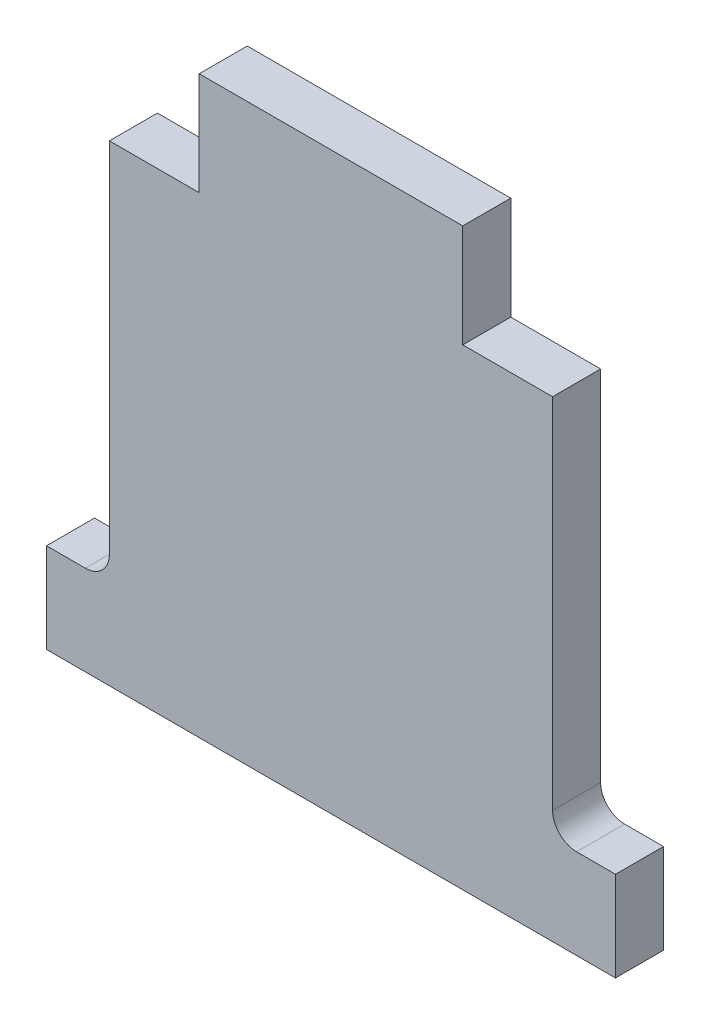
ISO-10303-21;
HEADER;
FILE_DESCRIPTION(('STEP AP214'),'2;1');
FILE_NAME('part.step','',(''),(''),'','','');
FILE_SCHEMA(('AUTOMOTIVE_DESIGN { 1 0 10303 214 1 1 1 1 }'));
ENDSEC;
DATA;
#1=APPLICATION_CONTEXT('core data for automotive mechanical design processes');
#2=APPLICATION_PROTOCOL_DEFINITION('international standard','automotive_design',2000,#1);
#3=PRODUCT_CONTEXT('',#1,'mechanical');
#4=PRODUCT('Part','Part','',(#3));
#5=PRODUCT_RELATED_PRODUCT_CATEGORY('part','',(#4));
#6=PRODUCT_DEFINITION_FORMATION('','',#4);
#7=PRODUCT_DEFINITION_CONTEXT('part definition',#1,'design');
#8=PRODUCT_DEFINITION('design','',#6,#7);
#9=PRODUCT_DEFINITION_SHAPE('','',#8);
#10=(LENGTH_UNIT() NAMED_UNIT(*) SI_UNIT(.MILLI.,.METRE.));
#11=(NAMED_UNIT(*) PLANE_ANGLE_UNIT() SI_UNIT($,.RADIAN.));
#12=(NAMED_UNIT(*) SI_UNIT($,.STERADIAN.) SOLID_ANGLE_UNIT());
#13=UNCERTAINTY_MEASURE_WITH_UNIT(LENGTH_MEASURE(1.E-05),#10,'distance_accuracy_value','');
#14=(GEOMETRIC_REPRESENTATION_CONTEXT(3) GLOBAL_UNCERTAINTY_ASSIGNED_CONTEXT((#13)) GLOBAL_UNIT_ASSIGNED_CONTEXT((#10,
#11,#12)) REPRESENTATION_CONTEXT('',''));
#15=CARTESIAN_POINT('',(0.,0.,0.));
#16=DIRECTION('',(0.,0.,1.));
#17=DIRECTION('',(1.,0.,0.));
#18=AXIS2_PLACEMENT_3D('',#15,#16,#17);
#19=CARTESIAN_POINT('',(-2.05,0.95,0.4));
#20=DIRECTION('',(0.,0.,-1.));
#21=DIRECTION('',(0.,-1.,0.));
#22=AXIS2_PLACEMENT_3D('',#19,#20,#21);
#23=PLANE('',#22);
#24=DIRECTION('',(0.,-1.,0.));
#25=VECTOR('',#24,1.);
#26=CARTESIAN_POINT('',(-2.375,0.,0.4));
#27=LINE('',#26,#25);
#28=CARTESIAN_POINT('',(-2.375,0.75,0.4));
#29=VERTEX_POINT('',#28);
#30=CARTESIAN_POINT('',(-2.375,0.,0.4));
#31=VERTEX_POINT('',#30);
#32=EDGE_CURVE('E228',#29,#31,#27,.T.);
#33=ORIENTED_EDGE('',*,*,#32,.T.);
#34=DIRECTION('',(1.,0.,0.));
#35=VECTOR('',#34,1.);
#36=CARTESIAN_POINT('',(-2.375,0.,0.4));
#37=LINE('',#36,#35);
#38=CARTESIAN_POINT('',(2.375,0.,0.4));
#39=VERTEX_POINT('',#38);
#40=EDGE_CURVE('E28',#31,#39,#37,.T.);
#41=ORIENTED_EDGE('',*,*,#40,.T.);
#42=DIRECTION('',(0.,1.,0.));
#43=VECTOR('',#42,1.);
#44=CARTESIAN_POINT('',(2.375,0.75,0.4));
#45=LINE('',#44,#43);
#46=CARTESIAN_POINT('',(2.375,0.75,0.4));
#47=VERTEX_POINT('',#46);
#48=EDGE_CURVE('E203',#39,#47,#45,.T.);
#49=ORIENTED_EDGE('',*,*,#48,.T.);
#50=DIRECTION('',(-1.,0.,0.));
#51=VECTOR('',#50,1.);
#52=CARTESIAN_POINT('',(2.05,0.75,0.4));
#53=LINE('',#52,#51);
#54=CARTESIAN_POINT('',(2.05,0.75,0.4));
#55=VERTEX_POINT('',#54);
#56=EDGE_CURVE('E233',#47,#55,#53,.T.);
#57=ORIENTED_EDGE('',*,*,#56,.T.);
#58=CARTESIAN_POINT('',(2.05,0.95,0.4));
#59=DIRECTION('',(0.,0.,-1.));
#60=DIRECTION('',(1.,0.,0.));
#61=AXIS2_PLACEMENT_3D('',#58,#59,#60);
#62=CIRCLE('',#61,0.2);
#63=CARTESIAN_POINT('',(1.85,0.95,0.4));
#64=VERTEX_POINT('',#63);
#65=EDGE_CURVE('E204',#55,#64,#62,.T.);
#66=ORIENTED_EDGE('',*,*,#65,.T.);
#67=DIRECTION('',(0.,1.,0.));
#68=VECTOR('',#67,1.);
#69=CARTESIAN_POINT('',(1.85,3.94,0.4));
#70=LINE('',#69,#68);
#71=CARTESIAN_POINT('',(1.85,3.94,0.4));
#72=VERTEX_POINT('',#71);
#73=EDGE_CURVE('E244',#64,#72,#70,.T.);
#74=ORIENTED_EDGE('',*,*,#73,.T.);
#75=DIRECTION('',(-1.,0.,0.));
#76=VECTOR('',#75,1.);
#77=CARTESIAN_POINT('',(1.1,3.94,0.4));
#78=LINE('',#77,#76);
#79=CARTESIAN_POINT('',(1.1,3.94,0.4));
#80=VERTEX_POINT('',#79);
#81=EDGE_CURVE('E219',#72,#80,#78,.T.);
#82=ORIENTED_EDGE('',*,*,#81,.T.);
#83=DIRECTION('',(0.,1.,0.));
#84=VECTOR('',#83,1.);
#85=CARTESIAN_POINT('',(1.1,4.8,0.4));
#86=LINE('',#85,#84);
#87=CARTESIAN_POINT('',(1.1,4.8,0.4));
#88=VERTEX_POINT('',#87);
#89=EDGE_CURVE('E198',#80,#88,#86,.T.);
#90=ORIENTED_EDGE('',*,*,#89,.T.);
#91=DIRECTION('',(-1.,0.,0.));
#92=VECTOR('',#91,1.);
#93=CARTESIAN_POINT('',(-1.1,4.8,0.4));
#94=LINE('',#93,#92);
#95=CARTESIAN_POINT('',(-1.1,4.8,0.4));
#96=VERTEX_POINT('',#95);
#97=EDGE_CURVE('E100',#88,#96,#94,.T.);
#98=ORIENTED_EDGE('',*,*,#97,.T.);
#99=DIRECTION('',(0.,-1.,0.));
#100=VECTOR('',#99,1.);
#101=CARTESIAN_POINT('',(-1.1,3.94,0.4));
#102=LINE('',#101,#100);
#103=CARTESIAN_POINT('',(-1.1,3.94,0.4));
#104=VERTEX_POINT('',#103);
#105=EDGE_CURVE('E187',#96,#104,#102,.T.);
#106=ORIENTED_EDGE('',*,*,#105,.T.);
#107=DIRECTION('',(-1.,0.,0.));
#108=VECTOR('',#107,1.);
#109=CARTESIAN_POINT('',(-1.85,3.94,0.4));
#110=LINE('',#109,#108);
#111=CARTESIAN_POINT('',(-1.85,3.94,0.4));
#112=VERTEX_POINT('',#111);
#113=EDGE_CURVE('E145',#104,#112,#110,.T.);
#114=ORIENTED_EDGE('',*,*,#113,.T.);
#115=DIRECTION('',(0.,-1.,0.));
#116=VECTOR('',#115,1.);
#117=CARTESIAN_POINT('',(-1.85,0.95,0.4));
#118=LINE('',#117,#116);
#119=CARTESIAN_POINT('',(-1.85,0.95,0.4));
#120=VERTEX_POINT('',#119);
#121=EDGE_CURVE('E176',#112,#120,#118,.T.);
#122=ORIENTED_EDGE('',*,*,#121,.T.);
#123=CARTESIAN_POINT('',(-2.05,0.95,0.4));
#124=DIRECTION('',(0.,0.,-1.));
#125=DIRECTION('',(-1.,0.,0.));
#126=AXIS2_PLACEMENT_3D('',#123,#124,#125);
#127=CIRCLE('',#126,0.2);
#128=CARTESIAN_POINT('',(-2.05,0.75,0.4));
#129=VERTEX_POINT('',#128);
#130=EDGE_CURVE('E21',#120,#129,#127,.T.);
#131=ORIENTED_EDGE('',*,*,#130,.T.);
#132=DIRECTION('',(-1.,0.,0.));
#133=VECTOR('',#132,1.);
#134=CARTESIAN_POINT('',(-2.375,0.75,0.4));
#135=LINE('',#134,#133);
#136=EDGE_CURVE('E209',#129,#29,#135,.T.);
#137=ORIENTED_EDGE('',*,*,#136,.T.);
#138=EDGE_LOOP('',(#33,#41,#49,#57,#66,#74,#82,#90,#98,#106,#114,#122,#131,#137));
#139=FACE_BOUND('',#138,.T.);
#140=ADVANCED_FACE('F17',(#139),#23,.F.);
#141=CARTESIAN_POINT('',(-2.05,0.95,-0.001));
#142=DIRECTION('',(0.,0.,-1.));
#143=DIRECTION('',(0.,-1.,0.));
#144=AXIS2_PLACEMENT_3D('',#141,#142,#143);
#145=PLANE('',#144);
#146=DIRECTION('',(0.,-1.,0.));
#147=VECTOR('',#146,1.);
#148=CARTESIAN_POINT('',(-2.375,0.,-0.001));
#149=LINE('',#148,#147);
#150=CARTESIAN_POINT('',(-2.375,0.75,-0.001));
#151=VERTEX_POINT('',#150);
#152=CARTESIAN_POINT('',(-2.375,0.,-0.001));
#153=VERTEX_POINT('',#152);
#154=EDGE_CURVE('E213',#151,#153,#149,.T.);
#155=ORIENTED_EDGE('',*,*,#154,.F.);
#156=DIRECTION('',(-1.,0.,0.));
#157=VECTOR('',#156,1.);
#158=CARTESIAN_POINT('',(-2.375,0.75,-0.001));
#159=LINE('',#158,#157);
#160=CARTESIAN_POINT('',(-2.05,0.75,-0.001));
#161=VERTEX_POINT('',#160);
#162=EDGE_CURVE('E171',#161,#151,#159,.T.);
#163=ORIENTED_EDGE('',*,*,#162,.F.);
#164=CARTESIAN_POINT('',(-2.05,0.95,-0.001));
#165=DIRECTION('',(0.,0.,-1.));
#166=DIRECTION('',(-1.,0.,0.));
#167=AXIS2_PLACEMENT_3D('',#164,#165,#166);
#168=CIRCLE('',#167,0.2);
#169=CARTESIAN_POINT('',(-1.85,0.95,-0.001));
#170=VERTEX_POINT('',#169);
#171=EDGE_CURVE('E167',#170,#161,#168,.T.);
#172=ORIENTED_EDGE('',*,*,#171,.F.);
#173=DIRECTION('',(0.,-1.,0.));
#174=VECTOR('',#173,1.);
#175=CARTESIAN_POINT('',(-1.85,0.95,-0.001));
#176=LINE('',#175,#174);
#177=CARTESIAN_POINT('',(-1.85,3.94,-0.001));
#178=VERTEX_POINT('',#177);
#179=EDGE_CURVE('E154',#178,#170,#176,.T.);
#180=ORIENTED_EDGE('',*,*,#179,.F.);
#181=DIRECTION('',(-1.,0.,0.));
#182=VECTOR('',#181,1.);
#183=CARTESIAN_POINT('',(-1.85,3.94,-0.001));
#184=LINE('',#183,#182);
#185=CARTESIAN_POINT('',(-1.1,3.94,-0.001));
#186=VERTEX_POINT('',#185);
#187=EDGE_CURVE('E189',#186,#178,#184,.T.);
#188=ORIENTED_EDGE('',*,*,#187,.F.);
#189=DIRECTION('',(0.,-1.,0.));
#190=VECTOR('',#189,1.);
#191=CARTESIAN_POINT('',(-1.1,3.94,-0.001));
#192=LINE('',#191,#190);
#193=CARTESIAN_POINT('',(-1.1,4.8,-0.001));
#194=VERTEX_POINT('',#193);
#195=EDGE_CURVE('E186',#194,#186,#192,.T.);
#196=ORIENTED_EDGE('',*,*,#195,.F.);
#197=DIRECTION('',(-1.,0.,0.));
#198=VECTOR('',#197,1.);
#199=CARTESIAN_POINT('',(-1.1,4.8,-0.001));
#200=LINE('',#199,#198);
#201=CARTESIAN_POINT('',(1.1,4.8,-0.001));
#202=VERTEX_POINT('',#201);
#203=EDGE_CURVE('E85',#202,#194,#200,.T.);
#204=ORIENTED_EDGE('',*,*,#203,.F.);
#205=DIRECTION('',(0.,1.,0.));
#206=VECTOR('',#205,1.);
#207=CARTESIAN_POINT('',(1.1,4.8,-0.001));
#208=LINE('',#207,#206);
#209=CARTESIAN_POINT('',(1.1,3.94,-0.001));
#210=VERTEX_POINT('',#209);
#211=EDGE_CURVE('E197',#210,#202,#208,.T.);
#212=ORIENTED_EDGE('',*,*,#211,.F.);
#213=DIRECTION('',(-1.,0.,0.));
#214=VECTOR('',#213,1.);
#215=CARTESIAN_POINT('',(1.1,3.94,-0.001));
#216=LINE('',#215,#214);
#217=CARTESIAN_POINT('',(1.85,3.94,-0.001));
#218=VERTEX_POINT('',#217);
#219=EDGE_CURVE('E256',#218,#210,#216,.T.);
#220=ORIENTED_EDGE('',*,*,#219,.F.);
#221=DIRECTION('',(0.,1.,0.));
#222=VECTOR('',#221,1.);
#223=CARTESIAN_POINT('',(1.85,3.94,-0.001));
#224=LINE('',#223,#222);
#225=CARTESIAN_POINT('',(1.85,0.95,-0.001));
#226=VERTEX_POINT('',#225);
#227=EDGE_CURVE('E208',#226,#218,#224,.T.);
#228=ORIENTED_EDGE('',*,*,#227,.F.);
#229=CARTESIAN_POINT('',(2.05,0.95,-0.001));
#230=DIRECTION('',(0.,0.,-1.));
#231=DIRECTION('',(1.,0.,0.));
#232=AXIS2_PLACEMENT_3D('',#229,#230,#231);
#233=CIRCLE('',#232,0.2);
#234=CARTESIAN_POINT('',(2.05,0.75,-0.001));
#235=VERTEX_POINT('',#234);
#236=EDGE_CURVE('E240',#235,#226,#233,.T.);
#237=ORIENTED_EDGE('',*,*,#236,.F.);
#238=DIRECTION('',(-1.,0.,0.));
#239=VECTOR('',#238,1.);
#240=CARTESIAN_POINT('',(2.05,0.75,-0.001));
#241=LINE('',#240,#239);
#242=CARTESIAN_POINT('',(2.375,0.75,-0.001));
#243=VERTEX_POINT('',#242);
#244=EDGE_CURVE('E216',#243,#235,#241,.T.);
#245=ORIENTED_EDGE('',*,*,#244,.F.);
#246=DIRECTION('',(0.,1.,0.));
#247=VECTOR('',#246,1.);
#248=CARTESIAN_POINT('',(2.375,0.75,-0.001));
#249=LINE('',#248,#247);
#250=CARTESIAN_POINT('',(2.375,0.,-0.001));
#251=VERTEX_POINT('',#250);
#252=EDGE_CURVE('E202',#251,#243,#249,.T.);
#253=ORIENTED_EDGE('',*,*,#252,.F.);
#254=DIRECTION('',(1.,0.,0.));
#255=VECTOR('',#254,1.);
#256=CARTESIAN_POINT('',(-2.375,0.,-0.001));
#257=LINE('',#256,#255);
#258=EDGE_CURVE('E11',#153,#251,#257,.T.);
#259=ORIENTED_EDGE('',*,*,#258,.F.);
#260=EDGE_LOOP('',(#155,#163,#172,#180,#188,#196,#204,#212,#220,#228,#237,#245,#253,#259));
#261=FACE_BOUND('',#260,.T.);
#262=ADVANCED_FACE('F169',(#261),#145,.T.);
#263=CARTESIAN_POINT('',(-2.375,0.,-0.001));
#264=DIRECTION('',(0.,-1.,0.));
#265=DIRECTION('',(0.,0.,-1.));
#266=AXIS2_PLACEMENT_3D('',#263,#264,#265);
#267=PLANE('',#266);
#268=DIRECTION('',(0.,0.,1.));
#269=VECTOR('',#268,1.);
#270=CARTESIAN_POINT('',(2.375,0.,-0.001));
#271=LINE('',#270,#269);
#272=EDGE_CURVE('E199',#251,#39,#271,.T.);
#273=ORIENTED_EDGE('',*,*,#272,.T.);
#274=ORIENTED_EDGE('',*,*,#40,.F.);
#275=DIRECTION('',(0.,0.,1.));
#276=VECTOR('',#275,1.);
#277=CARTESIAN_POINT('',(-2.375,0.,-0.001));
#278=LINE('',#277,#276);
#279=EDGE_CURVE('E251',#153,#31,#278,.T.);
#280=ORIENTED_EDGE('',*,*,#279,.F.);
#281=ORIENTED_EDGE('',*,*,#258,.T.);
#282=EDGE_LOOP('',(#273,#274,#280,#281));
#283=FACE_BOUND('',#282,.T.);
#284=ADVANCED_FACE('F19',(#283),#267,.T.);
#285=CARTESIAN_POINT('',(2.375,0.75,-0.001));
#286=DIRECTION('',(1.,0.,0.));
#287=DIRECTION('',(0.,1.,0.));
#288=AXIS2_PLACEMENT_3D('',#285,#286,#287);
#289=PLANE('',#288);
#290=DIRECTION('',(0.,0.,1.));
#291=VECTOR('',#290,1.);
#292=CARTESIAN_POINT('',(2.375,0.75,-0.001));
#293=LINE('',#292,#291);
#294=EDGE_CURVE('E229',#243,#47,#293,.T.);
#295=ORIENTED_EDGE('',*,*,#294,.T.);
#296=ORIENTED_EDGE('',*,*,#48,.F.);
#297=ORIENTED_EDGE('',*,*,#272,.F.);
#298=ORIENTED_EDGE('',*,*,#252,.T.);
#299=EDGE_LOOP('',(#295,#296,#297,#298));
#300=FACE_BOUND('',#299,.T.);
#301=ADVANCED_FACE('F318',(#300),#289,.T.);
#302=CARTESIAN_POINT('',(2.05,0.75,-0.001));
#303=DIRECTION('',(0.,1.,0.));
#304=DIRECTION('',(1.,0.,0.));
#305=AXIS2_PLACEMENT_3D('',#302,#303,#304);
#306=PLANE('',#305);
#307=DIRECTION('',(0.,0.,1.));
#308=VECTOR('',#307,1.);
#309=CARTESIAN_POINT('',(2.05,0.75,-0.001));
#310=LINE('',#309,#308);
#311=EDGE_CURVE('E207',#235,#55,#310,.T.);
#312=ORIENTED_EDGE('',*,*,#311,.T.);
#313=ORIENTED_EDGE('',*,*,#56,.F.);
#314=ORIENTED_EDGE('',*,*,#294,.F.);
#315=ORIENTED_EDGE('',*,*,#244,.T.);
#316=EDGE_LOOP('',(#312,#313,#314,#315));
#317=FACE_BOUND('',#316,.T.);
#318=ADVANCED_FACE('F326',(#317),#306,.T.);
#319=CARTESIAN_POINT('',(2.05,0.95,-0.001));
#320=DIRECTION('',(0.,0.,1.));
#321=DIRECTION('',(1.,0.,0.));
#322=AXIS2_PLACEMENT_3D('',#319,#320,#321);
#323=CYLINDRICAL_SURFACE('',#322,0.2);
#324=DIRECTION('',(0.,0.,1.));
#325=VECTOR('',#324,1.);
#326=CARTESIAN_POINT('',(1.85,0.95,-0.001));
#327=LINE('',#326,#325);
#328=EDGE_CURVE('E236',#226,#64,#327,.T.);
#329=ORIENTED_EDGE('',*,*,#328,.T.);
#330=ORIENTED_EDGE('',*,*,#65,.F.);
#331=ORIENTED_EDGE('',*,*,#311,.F.);
#332=ORIENTED_EDGE('',*,*,#236,.T.);
#333=EDGE_LOOP('',(#329,#330,#331,#332));
#334=FACE_BOUND('',#333,.T.);
#335=ADVANCED_FACE('F368',(#334),#323,.F.);
#336=CARTESIAN_POINT('',(1.85,3.94,-0.001));
#337=DIRECTION('',(1.,0.,0.));
#338=DIRECTION('',(0.,1.,0.));
#339=AXIS2_PLACEMENT_3D('',#336,#337,#338);
#340=PLANE('',#339);
#341=DIRECTION('',(0.,0.,1.));
#342=VECTOR('',#341,1.);
#343=CARTESIAN_POINT('',(1.85,3.94,-0.001));
#344=LINE('',#343,#342);
#345=EDGE_CURVE('E223',#218,#72,#344,.T.);
#346=ORIENTED_EDGE('',*,*,#345,.T.);
#347=ORIENTED_EDGE('',*,*,#73,.F.);
#348=ORIENTED_EDGE('',*,*,#328,.F.);
#349=ORIENTED_EDGE('',*,*,#227,.T.);
#350=EDGE_LOOP('',(#346,#347,#348,#349));
#351=FACE_BOUND('',#350,.T.);
#352=ADVANCED_FACE('F370',(#351),#340,.T.);
#353=CARTESIAN_POINT('',(1.1,3.94,-0.001));
#354=DIRECTION('',(0.,1.,0.));
#355=DIRECTION('',(1.,0.,0.));
#356=AXIS2_PLACEMENT_3D('',#353,#354,#355);
#357=PLANE('',#356);
#358=DIRECTION('',(0.,0.,1.));
#359=VECTOR('',#358,1.);
#360=CARTESIAN_POINT('',(1.1,3.94,-0.001));
#361=LINE('',#360,#359);
#362=EDGE_CURVE('E193',#210,#80,#361,.T.);
#363=ORIENTED_EDGE('',*,*,#362,.T.);
#364=ORIENTED_EDGE('',*,*,#81,.F.);
#365=ORIENTED_EDGE('',*,*,#345,.F.);
#366=ORIENTED_EDGE('',*,*,#219,.T.);
#367=EDGE_LOOP('',(#363,#364,#365,#366));
#368=FACE_BOUND('',#367,.T.);
#369=ADVANCED_FACE('F375',(#368),#357,.T.);
#370=CARTESIAN_POINT('',(1.1,4.8,-0.001));
#371=DIRECTION('',(1.,0.,0.));
#372=DIRECTION('',(0.,1.,0.));
#373=AXIS2_PLACEMENT_3D('',#370,#371,#372);
#374=PLANE('',#373);
#375=DIRECTION('',(0.,0.,1.));
#376=VECTOR('',#375,1.);
#377=CARTESIAN_POINT('',(1.1,4.8,-0.001));
#378=LINE('',#377,#376);
#379=EDGE_CURVE('E247',#202,#88,#378,.T.);
#380=ORIENTED_EDGE('',*,*,#379,.T.);
#381=ORIENTED_EDGE('',*,*,#89,.F.);
#382=ORIENTED_EDGE('',*,*,#362,.F.);
#383=ORIENTED_EDGE('',*,*,#211,.T.);
#384=EDGE_LOOP('',(#380,#381,#382,#383));
#385=FACE_BOUND('',#384,.T.);
#386=ADVANCED_FACE('F379',(#385),#374,.T.);
#387=CARTESIAN_POINT('',(-1.1,4.8,-0.001));
#388=DIRECTION('',(0.,1.,0.));
#389=DIRECTION('',(1.,0.,0.));
#390=AXIS2_PLACEMENT_3D('',#387,#388,#389);
#391=PLANE('',#390);
#392=DIRECTION('',(0.,0.,1.));
#393=VECTOR('',#392,1.);
#394=CARTESIAN_POINT('',(-1.1,4.8,-0.001));
#395=LINE('',#394,#393);
#396=EDGE_CURVE('E185',#194,#96,#395,.T.);
#397=ORIENTED_EDGE('',*,*,#396,.T.);
#398=ORIENTED_EDGE('',*,*,#97,.F.);
#399=ORIENTED_EDGE('',*,*,#379,.F.);
#400=ORIENTED_EDGE('',*,*,#203,.T.);
#401=EDGE_LOOP('',(#397,#398,#399,#400));
#402=FACE_BOUND('',#401,.T.);
#403=ADVANCED_FACE('F381',(#402),#391,.T.);
#404=CARTESIAN_POINT('',(-1.1,3.94,-0.001));
#405=DIRECTION('',(-1.,0.,0.));
#406=DIRECTION('',(0.,0.,1.));
#407=AXIS2_PLACEMENT_3D('',#404,#405,#406);
#408=PLANE('',#407);
#409=DIRECTION('',(0.,0.,1.));
#410=VECTOR('',#409,1.);
#411=CARTESIAN_POINT('',(-1.1,3.94,-0.001));
#412=LINE('',#411,#410);
#413=EDGE_CURVE('E191',#186,#104,#412,.T.);
#414=ORIENTED_EDGE('',*,*,#413,.T.);
#415=ORIENTED_EDGE('',*,*,#105,.F.);
#416=ORIENTED_EDGE('',*,*,#396,.F.);
#417=ORIENTED_EDGE('',*,*,#195,.T.);
#418=EDGE_LOOP('',(#414,#415,#416,#417));
#419=FACE_BOUND('',#418,.T.);
#420=ADVANCED_FACE('F385',(#419),#408,.T.);
#421=CARTESIAN_POINT('',(-1.85,3.94,-0.001));
#422=DIRECTION('',(0.,1.,0.));
#423=DIRECTION('',(1.,0.,0.));
#424=AXIS2_PLACEMENT_3D('',#421,#422,#423);
#425=PLANE('',#424);
#426=DIRECTION('',(0.,0.,1.));
#427=VECTOR('',#426,1.);
#428=CARTESIAN_POINT('',(-1.85,3.94,-0.001));
#429=LINE('',#428,#427);
#430=EDGE_CURVE('E161',#178,#112,#429,.T.);
#431=ORIENTED_EDGE('',*,*,#430,.T.);
#432=ORIENTED_EDGE('',*,*,#113,.F.);
#433=ORIENTED_EDGE('',*,*,#413,.F.);
#434=ORIENTED_EDGE('',*,*,#187,.T.);
#435=EDGE_LOOP('',(#431,#432,#433,#434));
#436=FACE_BOUND('',#435,.T.);
#437=ADVANCED_FACE('F388',(#436),#425,.T.);
#438=CARTESIAN_POINT('',(-1.85,0.95,-0.001));
#439=DIRECTION('',(-1.,0.,0.));
#440=DIRECTION('',(0.,0.,1.));
#441=AXIS2_PLACEMENT_3D('',#438,#439,#440);
#442=PLANE('',#441);
#443=DIRECTION('',(0.,0.,1.));
#444=VECTOR('',#443,1.);
#445=CARTESIAN_POINT('',(-1.85,0.95,-0.001));
#446=LINE('',#445,#444);
#447=EDGE_CURVE('E159',#170,#120,#446,.T.);
#448=ORIENTED_EDGE('',*,*,#447,.T.);
#449=ORIENTED_EDGE('',*,*,#121,.F.);
#450=ORIENTED_EDGE('',*,*,#430,.F.);
#451=ORIENTED_EDGE('',*,*,#179,.T.);
#452=EDGE_LOOP('',(#448,#449,#450,#451));
#453=FACE_BOUND('',#452,.T.);
#454=ADVANCED_FACE('F156',(#453),#442,.T.);
#455=CARTESIAN_POINT('',(-2.05,0.95,-0.001));
#456=DIRECTION('',(0.,0.,1.));
#457=DIRECTION('',(1.,0.,0.));
#458=AXIS2_PLACEMENT_3D('',#455,#456,#457);
#459=CYLINDRICAL_SURFACE('',#458,0.2);
#460=DIRECTION('',(0.,0.,1.));
#461=VECTOR('',#460,1.);
#462=CARTESIAN_POINT('',(-2.05,0.75,-0.001));
#463=LINE('',#462,#461);
#464=EDGE_CURVE('E212',#161,#129,#463,.T.);
#465=ORIENTED_EDGE('',*,*,#464,.T.);
#466=ORIENTED_EDGE('',*,*,#130,.F.);
#467=ORIENTED_EDGE('',*,*,#447,.F.);
#468=ORIENTED_EDGE('',*,*,#171,.T.);
#469=EDGE_LOOP('',(#465,#466,#467,#468));
#470=FACE_BOUND('',#469,.T.);
#471=ADVANCED_FACE('F178',(#470),#459,.F.);
#472=CARTESIAN_POINT('',(-2.375,0.75,-0.001));
#473=DIRECTION('',(0.,1.,0.));
#474=DIRECTION('',(1.,0.,0.));
#475=AXIS2_PLACEMENT_3D('',#472,#473,#474);
#476=PLANE('',#475);
#477=DIRECTION('',(0.,0.,1.));
#478=VECTOR('',#477,1.);
#479=CARTESIAN_POINT('',(-2.375,0.75,-0.001));
#480=LINE('',#479,#478);
#481=EDGE_CURVE('E224',#151,#29,#480,.T.);
#482=ORIENTED_EDGE('',*,*,#481,.T.);
#483=ORIENTED_EDGE('',*,*,#136,.F.);
#484=ORIENTED_EDGE('',*,*,#464,.F.);
#485=ORIENTED_EDGE('',*,*,#162,.T.);
#486=EDGE_LOOP('',(#482,#483,#484,#485));
#487=FACE_BOUND('',#486,.T.);
#488=ADVANCED_FACE('F303',(#487),#476,.T.);
#489=CARTESIAN_POINT('',(-2.375,0.,-0.001));
#490=DIRECTION('',(-1.,0.,0.));
#491=DIRECTION('',(0.,0.,1.));
#492=AXIS2_PLACEMENT_3D('',#489,#490,#491);
#493=PLANE('',#492);
#494=ORIENTED_EDGE('',*,*,#279,.T.);
#495=ORIENTED_EDGE('',*,*,#32,.F.);
#496=ORIENTED_EDGE('',*,*,#481,.F.);
#497=ORIENTED_EDGE('',*,*,#154,.T.);
#498=EDGE_LOOP('',(#494,#495,#496,#497));
#499=FACE_BOUND('',#498,.T.);
#500=ADVANCED_FACE('F308',(#499),#493,.T.);
#501=CLOSED_SHELL('',(#140,#262,#284,#301,#318,#335,#352,#369,#386,#403,#420,#437,#454,#471,
#488,#500));
#502=MANIFOLD_SOLID_BREP('B1',#501);
#503=ADVANCED_BREP_SHAPE_REPRESENTATION('',(#18,#502),#14);
#504=SHAPE_DEFINITION_REPRESENTATION(#9,#503);
ENDSEC;
END-ISO-10303-21;
